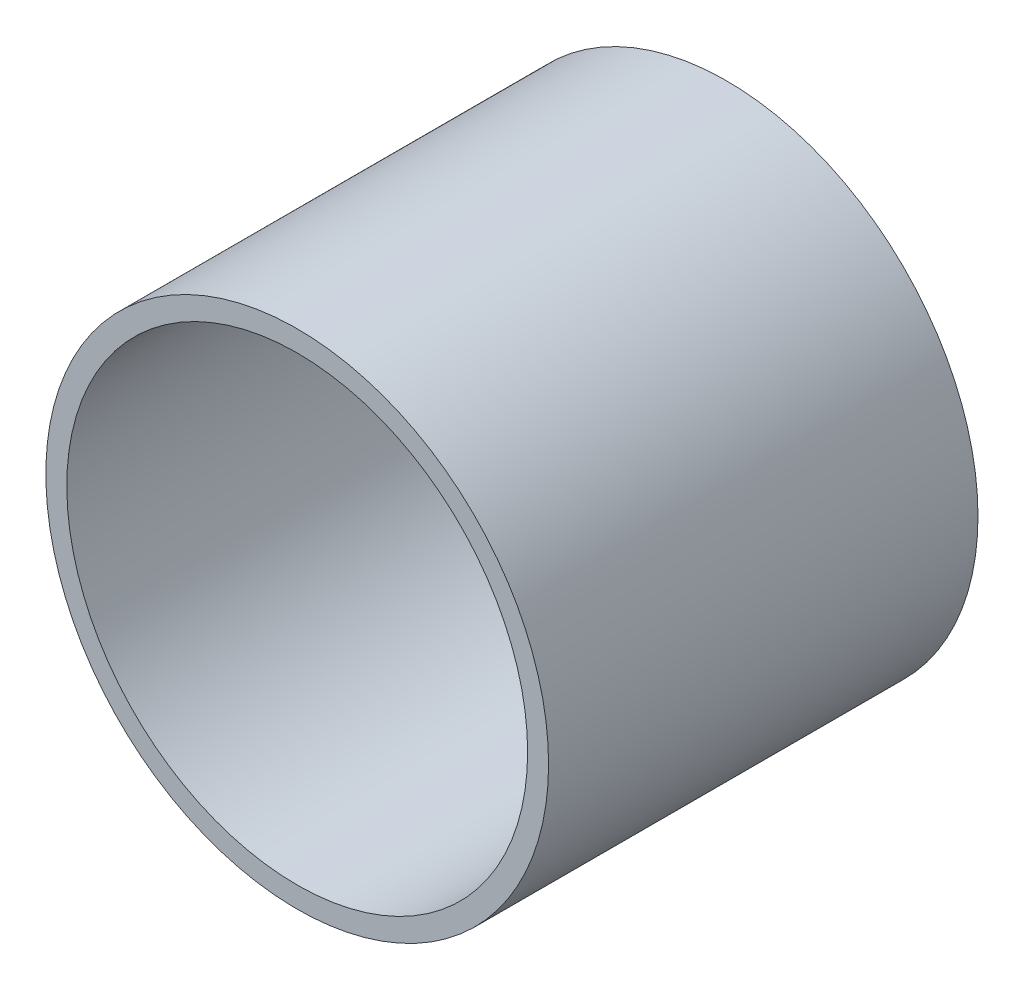
ISO-10303-21;
HEADER;
FILE_DESCRIPTION(('STEP AP214'),'2;1');
FILE_NAME('part.step','',(''),(''),'','','');
FILE_SCHEMA(('AUTOMOTIVE_DESIGN { 1 0 10303 214 1 1 1 1 }'));
ENDSEC;
DATA;
#1=APPLICATION_CONTEXT('core data for automotive mechanical design processes');
#2=APPLICATION_PROTOCOL_DEFINITION('international standard','automotive_design',2000,#1);
#3=PRODUCT_CONTEXT('',#1,'mechanical');
#4=PRODUCT('Part','Part','',(#3));
#5=PRODUCT_RELATED_PRODUCT_CATEGORY('part','',(#4));
#6=PRODUCT_DEFINITION_FORMATION('','',#4);
#7=PRODUCT_DEFINITION_CONTEXT('part definition',#1,'design');
#8=PRODUCT_DEFINITION('design','',#6,#7);
#9=PRODUCT_DEFINITION_SHAPE('','',#8);
#10=(LENGTH_UNIT() NAMED_UNIT(*) SI_UNIT(.MILLI.,.METRE.));
#11=(NAMED_UNIT(*) PLANE_ANGLE_UNIT() SI_UNIT($,.RADIAN.));
#12=(NAMED_UNIT(*) SI_UNIT($,.STERADIAN.) SOLID_ANGLE_UNIT());
#13=UNCERTAINTY_MEASURE_WITH_UNIT(LENGTH_MEASURE(1.E-05),#10,'distance_accuracy_value','');
#14=(GEOMETRIC_REPRESENTATION_CONTEXT(3) GLOBAL_UNCERTAINTY_ASSIGNED_CONTEXT((#13)) GLOBAL_UNIT_ASSIGNED_CONTEXT((#10,
#11,#12)) REPRESENTATION_CONTEXT('',''));
#15=CARTESIAN_POINT('',(0.,0.,0.));
#16=DIRECTION('',(0.,0.,1.));
#17=DIRECTION('',(1.,0.,0.));
#18=AXIS2_PLACEMENT_3D('',#15,#16,#17);
#19=CARTESIAN_POINT('',(0.,0.,104.14));
#20=DIRECTION('',(0.,0.,-1.));
#21=DIRECTION('',(-1.,0.,0.));
#22=AXIS2_PLACEMENT_3D('',#19,#20,#21);
#23=CYLINDRICAL_SURFACE('',#22,55.88);
#24=DIRECTION('',(0.,0.,-1.));
#25=VECTOR('',#24,1.);
#26=CARTESIAN_POINT('',(-7.6199999999994,-55.3580165829666,6.35));
#27=LINE('',#26,#25);
#28=CARTESIAN_POINT('',(-7.6199999999994,-55.3580165829666,6.35));
#29=VERTEX_POINT('',#28);
#30=CARTESIAN_POINT('',(-7.6199999999994,-55.3580165829666,0.));
#31=VERTEX_POINT('',#30);
#32=EDGE_CURVE('E208',#29,#31,#27,.T.);
#33=ORIENTED_EDGE('',*,*,#32,.T.);
#34=CARTESIAN_POINT('',(0.,0.,0.));
#35=DIRECTION('',(0.,0.,1.));
#36=DIRECTION('',(1.,0.,0.));
#37=AXIS2_PLACEMENT_3D('',#34,#35,#36);
#38=CIRCLE('',#37,55.88);
#39=CARTESIAN_POINT('',(-55.3580165829665,-7.61999999999999,0.));
#40=VERTEX_POINT('',#39);
#41=EDGE_CURVE('E369',#40,#31,#38,.T.);
#42=ORIENTED_EDGE('',*,*,#41,.F.);
#43=DIRECTION('',(0.,0.,-1.));
#44=VECTOR('',#43,1.);
#45=CARTESIAN_POINT('',(-55.3580165829665,-7.61999999999999,6.35));
#46=LINE('',#45,#44);
#47=CARTESIAN_POINT('',(-55.3580165829665,-7.61999999999999,6.35));
#48=VERTEX_POINT('',#47);
#49=EDGE_CURVE('E255',#48,#40,#46,.T.);
#50=ORIENTED_EDGE('',*,*,#49,.F.);
#51=CARTESIAN_POINT('',(0.,0.,6.35));
#52=DIRECTION('',(0.,0.,-1.));
#53=DIRECTION('',(1.,0.,0.));
#54=AXIS2_PLACEMENT_3D('',#51,#52,#53);
#55=CIRCLE('',#54,55.88);
#56=CARTESIAN_POINT('',(-55.3580165829665,7.61999999999998,6.35));
#57=VERTEX_POINT('',#56);
#58=EDGE_CURVE('E231',#48,#57,#55,.T.);
#59=ORIENTED_EDGE('',*,*,#58,.T.);
#60=DIRECTION('',(0.,0.,-1.));
#61=VECTOR('',#60,1.);
#62=CARTESIAN_POINT('',(-55.3580165829665,7.61999999999998,6.35));
#63=LINE('',#62,#61);
#64=CARTESIAN_POINT('',(-55.3580165829665,7.61999999999998,0.));
#65=VERTEX_POINT('',#64);
#66=EDGE_CURVE('E251',#57,#65,#63,.T.);
#67=ORIENTED_EDGE('',*,*,#66,.T.);
#68=CARTESIAN_POINT('',(-7.62000000000019,55.3580165829665,0.));
#69=VERTEX_POINT('',#68);
#70=EDGE_CURVE('E363',#69,#65,#38,.T.);
#71=ORIENTED_EDGE('',*,*,#70,.F.);
#72=DIRECTION('',(0.,0.,-1.));
#73=VECTOR('',#72,1.);
#74=CARTESIAN_POINT('',(-7.62000000000019,55.3580165829665,6.35));
#75=LINE('',#74,#73);
#76=CARTESIAN_POINT('',(-7.62000000000019,55.3580165829665,6.35));
#77=VERTEX_POINT('',#76);
#78=EDGE_CURVE('E303',#77,#69,#75,.T.);
#79=ORIENTED_EDGE('',*,*,#78,.F.);
#80=CARTESIAN_POINT('',(0.,0.,6.35));
#81=DIRECTION('',(0.,0.,-1.));
#82=DIRECTION('',(0.,-1.,0.));
#83=AXIS2_PLACEMENT_3D('',#80,#81,#82);
#84=CIRCLE('',#83,55.88);
#85=CARTESIAN_POINT('',(7.61999999999979,55.3580165829666,6.35));
#86=VERTEX_POINT('',#85);
#87=EDGE_CURVE('E277',#77,#86,#84,.T.);
#88=ORIENTED_EDGE('',*,*,#87,.T.);
#89=DIRECTION('',(0.,0.,-1.));
#90=VECTOR('',#89,1.);
#91=CARTESIAN_POINT('',(7.61999999999979,55.3580165829666,6.35));
#92=LINE('',#91,#90);
#93=CARTESIAN_POINT('',(7.61999999999979,55.3580165829666,0.));
#94=VERTEX_POINT('',#93);
#95=EDGE_CURVE('E299',#86,#94,#92,.T.);
#96=ORIENTED_EDGE('',*,*,#95,.T.);
#97=CARTESIAN_POINT('',(55.3580165829665,7.61999999999999,0.));
#98=VERTEX_POINT('',#97);
#99=EDGE_CURVE('E360',#98,#94,#38,.T.);
#100=ORIENTED_EDGE('',*,*,#99,.F.);
#101=DIRECTION('',(0.,0.,-1.));
#102=VECTOR('',#101,1.);
#103=CARTESIAN_POINT('',(55.3580165829665,7.61999999999999,6.35));
#104=LINE('',#103,#102);
#105=CARTESIAN_POINT('',(55.3580165829665,7.61999999999999,6.35));
#106=VERTEX_POINT('',#105);
#107=EDGE_CURVE('E352',#106,#98,#104,.T.);
#108=ORIENTED_EDGE('',*,*,#107,.F.);
#109=CARTESIAN_POINT('',(0.,0.,6.35));
#110=DIRECTION('',(0.,0.,-1.));
#111=DIRECTION('',(-1.,0.,0.));
#112=AXIS2_PLACEMENT_3D('',#109,#110,#111);
#113=CIRCLE('',#112,55.88);
#114=CARTESIAN_POINT('',(55.3580165829665,-7.61999999999998,6.35));
#115=VERTEX_POINT('',#114);
#116=EDGE_CURVE('E326',#106,#115,#113,.T.);
#117=ORIENTED_EDGE('',*,*,#116,.T.);
#118=DIRECTION('',(0.,0.,-1.));
#119=VECTOR('',#118,1.);
#120=CARTESIAN_POINT('',(55.3580165829665,-7.61999999999998,6.35));
#121=LINE('',#120,#119);
#122=CARTESIAN_POINT('',(55.3580165829665,-7.61999999999998,0.));
#123=VERTEX_POINT('',#122);
#124=EDGE_CURVE('E348',#115,#123,#121,.T.);
#125=ORIENTED_EDGE('',*,*,#124,.T.);
#126=CARTESIAN_POINT('',(7.62000000000057,-55.3580165829665,0.));
#127=VERTEX_POINT('',#126);
#128=EDGE_CURVE('E347',#127,#123,#38,.T.);
#129=ORIENTED_EDGE('',*,*,#128,.F.);
#130=DIRECTION('',(0.,0.,-1.));
#131=VECTOR('',#130,1.);
#132=CARTESIAN_POINT('',(7.62000000000057,-55.3580165829665,6.35));
#133=LINE('',#132,#131);
#134=CARTESIAN_POINT('',(7.62000000000057,-55.3580165829665,6.35));
#135=VERTEX_POINT('',#134);
#136=EDGE_CURVE('E170',#135,#127,#133,.T.);
#137=ORIENTED_EDGE('',*,*,#136,.F.);
#138=CARTESIAN_POINT('',(0.,0.,6.35));
#139=DIRECTION('',(0.,0.,-1.));
#140=DIRECTION('',(0.,1.,0.));
#141=AXIS2_PLACEMENT_3D('',#138,#139,#140);
#142=CIRCLE('',#141,55.88);
#143=EDGE_CURVE('E180',#135,#29,#142,.T.);
#144=ORIENTED_EDGE('',*,*,#143,.T.);
#145=EDGE_LOOP('',(#33,#42,#50,#59,#67,#71,#79,#88,#96,#100,#108,#117,#125,#129,#137,#144));
#146=FACE_BOUND('',#145,.T.);
#147=CARTESIAN_POINT('',(0.,0.,104.14));
#148=DIRECTION('',(0.,0.,1.));
#149=DIRECTION('',(1.,0.,0.));
#150=AXIS2_PLACEMENT_3D('',#147,#148,#149);
#151=CIRCLE('',#150,55.88);
#152=CARTESIAN_POINT('',(55.88,0.,104.14));
#153=VERTEX_POINT('',#152);
#154=EDGE_CURVE('E54',#153,#153,#151,.T.);
#155=ORIENTED_EDGE('',*,*,#154,.T.);
#156=EDGE_LOOP('',(#155));
#157=FACE_BOUND('',#156,.T.);
#158=ADVANCED_FACE('F45',(#146,#157),#23,.F.);
#159=CARTESIAN_POINT('',(0.,0.,104.14));
#160=DIRECTION('',(0.,0.,-1.));
#161=DIRECTION('',(-1.,0.,0.));
#162=AXIS2_PLACEMENT_3D('',#159,#160,#161);
#163=CYLINDRICAL_SURFACE('',#162,60.96);
#164=CARTESIAN_POINT('',(0.,0.,104.14));
#165=DIRECTION('',(0.,0.,1.));
#166=DIRECTION('',(1.,0.,0.));
#167=AXIS2_PLACEMENT_3D('',#164,#165,#166);
#168=CIRCLE('',#167,60.96);
#169=CARTESIAN_POINT('',(60.96,0.,104.14));
#170=VERTEX_POINT('',#169);
#171=EDGE_CURVE('E11',#170,#170,#168,.T.);
#172=ORIENTED_EDGE('',*,*,#171,.F.);
#173=EDGE_LOOP('',(#172));
#174=FACE_BOUND('',#173,.T.);
#175=CARTESIAN_POINT('',(0.,0.,0.));
#176=DIRECTION('',(0.,0.,1.));
#177=DIRECTION('',(1.,0.,0.));
#178=AXIS2_PLACEMENT_3D('',#175,#176,#177);
#179=CIRCLE('',#178,60.96);
#180=CARTESIAN_POINT('',(60.96,0.,0.));
#181=VERTEX_POINT('',#180);
#182=EDGE_CURVE('E48',#181,#181,#179,.T.);
#183=ORIENTED_EDGE('',*,*,#182,.T.);
#184=EDGE_LOOP('',(#183));
#185=FACE_BOUND('',#184,.T.);
#186=ADVANCED_FACE('F393',(#174,#185),#163,.T.);
#187=CARTESIAN_POINT('',(0.,0.,104.14));
#188=DIRECTION('',(0.,0.,1.));
#189=DIRECTION('',(1.,0.,0.));
#190=AXIS2_PLACEMENT_3D('',#187,#188,#189);
#191=PLANE('',#190);
#192=ORIENTED_EDGE('',*,*,#154,.F.);
#193=EDGE_LOOP('',(#192));
#194=FACE_BOUND('',#193,.T.);
#195=ORIENTED_EDGE('',*,*,#171,.T.);
#196=EDGE_LOOP('',(#195));
#197=FACE_BOUND('',#196,.T.);
#198=ADVANCED_FACE('F397',(#194,#197),#191,.T.);
#199=CARTESIAN_POINT('',(0.,0.,0.));
#200=DIRECTION('',(0.,0.,1.));
#201=DIRECTION('',(1.,0.,0.));
#202=AXIS2_PLACEMENT_3D('',#199,#200,#201);
#203=PLANE('',#202);
#204=ORIENTED_EDGE('',*,*,#99,.T.);
#205=DIRECTION('',(0.,-1.,0.));
#206=VECTOR('',#205,1.);
#207=CARTESIAN_POINT('',(7.61999999999983,48.26,0.));
#208=LINE('',#207,#206);
#209=CARTESIAN_POINT('',(7.61999999999983,48.26,0.));
#210=VERTEX_POINT('',#209);
#211=EDGE_CURVE('E273',#94,#210,#208,.T.);
#212=ORIENTED_EDGE('',*,*,#211,.T.);
#213=CARTESIAN_POINT('',(-1.6849888941257E-13,48.26,0.));
#214=DIRECTION('',(0.,0.,-1.));
#215=DIRECTION('',(0.,-1.,0.));
#216=AXIS2_PLACEMENT_3D('',#213,#214,#215);
#217=CIRCLE('',#216,7.61999999999999);
#218=CARTESIAN_POINT('',(-7.62000000000016,48.26,0.));
#219=VERTEX_POINT('',#218);
#220=EDGE_CURVE('E264',#210,#219,#217,.T.);
#221=ORIENTED_EDGE('',*,*,#220,.T.);
#222=DIRECTION('',(0.,1.,0.));
#223=VECTOR('',#222,1.);
#224=CARTESIAN_POINT('',(-7.62000000000016,48.26,0.));
#225=LINE('',#224,#223);
#226=EDGE_CURVE('E289',#219,#69,#225,.T.);
#227=ORIENTED_EDGE('',*,*,#226,.T.);
#228=ORIENTED_EDGE('',*,*,#70,.T.);
#229=DIRECTION('',(1.,0.,0.));
#230=VECTOR('',#229,1.);
#231=CARTESIAN_POINT('',(-48.26,7.61999999999999,0.));
#232=LINE('',#231,#230);
#233=CARTESIAN_POINT('',(-48.26,7.61999999999999,0.));
#234=VERTEX_POINT('',#233);
#235=EDGE_CURVE('E227',#65,#234,#232,.T.);
#236=ORIENTED_EDGE('',*,*,#235,.T.);
#237=CARTESIAN_POINT('',(-48.26,0.,0.));
#238=DIRECTION('',(0.,0.,-1.));
#239=DIRECTION('',(1.,0.,0.));
#240=AXIS2_PLACEMENT_3D('',#237,#238,#239);
#241=CIRCLE('',#240,7.61999999999999);
#242=CARTESIAN_POINT('',(-48.26,-7.61999999999999,0.));
#243=VERTEX_POINT('',#242);
#244=EDGE_CURVE('E218',#234,#243,#241,.T.);
#245=ORIENTED_EDGE('',*,*,#244,.T.);
#246=DIRECTION('',(-1.,0.,0.));
#247=VECTOR('',#246,1.);
#248=CARTESIAN_POINT('',(-48.26,-7.61999999999999,0.));
#249=LINE('',#248,#247);
#250=EDGE_CURVE('E69',#243,#40,#249,.T.);
#251=ORIENTED_EDGE('',*,*,#250,.T.);
#252=ORIENTED_EDGE('',*,*,#41,.T.);
#253=DIRECTION('',(0.,1.,0.));
#254=VECTOR('',#253,1.);
#255=CARTESIAN_POINT('',(-7.61999999999949,-48.2600000000001,0.));
#256=LINE('',#255,#254);
#257=CARTESIAN_POINT('',(-7.61999999999949,-48.2600000000001,0.));
#258=VERTEX_POINT('',#257);
#259=EDGE_CURVE('E186',#31,#258,#256,.T.);
#260=ORIENTED_EDGE('',*,*,#259,.T.);
#261=CARTESIAN_POINT('',(5.05496668237709E-13,-48.26,0.));
#262=DIRECTION('',(0.,0.,-1.));
#263=DIRECTION('',(0.,1.,0.));
#264=AXIS2_PLACEMENT_3D('',#261,#262,#263);
#265=CIRCLE('',#264,7.61999999999999);
#266=CARTESIAN_POINT('',(7.6200000000005,-48.2599999999999,0.));
#267=VERTEX_POINT('',#266);
#268=EDGE_CURVE('E199',#258,#267,#265,.T.);
#269=ORIENTED_EDGE('',*,*,#268,.T.);
#270=DIRECTION('',(0.,-1.,0.));
#271=VECTOR('',#270,1.);
#272=CARTESIAN_POINT('',(7.6200000000005,-48.2599999999999,0.));
#273=LINE('',#272,#271);
#274=EDGE_CURVE('E62',#267,#127,#273,.T.);
#275=ORIENTED_EDGE('',*,*,#274,.T.);
#276=ORIENTED_EDGE('',*,*,#128,.T.);
#277=DIRECTION('',(-1.,0.,0.));
#278=VECTOR('',#277,1.);
#279=CARTESIAN_POINT('',(48.26,-7.61999999999999,0.));
#280=LINE('',#279,#278);
#281=CARTESIAN_POINT('',(48.26,-7.61999999999999,0.));
#282=VERTEX_POINT('',#281);
#283=EDGE_CURVE('E322',#123,#282,#280,.T.);
#284=ORIENTED_EDGE('',*,*,#283,.T.);
#285=CARTESIAN_POINT('',(48.26,0.,0.));
#286=DIRECTION('',(0.,0.,-1.));
#287=DIRECTION('',(-1.,0.,0.));
#288=AXIS2_PLACEMENT_3D('',#285,#286,#287);
#289=CIRCLE('',#288,7.61999999999999);
#290=CARTESIAN_POINT('',(48.26,7.61999999999999,0.));
#291=VERTEX_POINT('',#290);
#292=EDGE_CURVE('E313',#282,#291,#289,.T.);
#293=ORIENTED_EDGE('',*,*,#292,.T.);
#294=DIRECTION('',(1.,0.,0.));
#295=VECTOR('',#294,1.);
#296=CARTESIAN_POINT('',(48.26,7.61999999999999,0.));
#297=LINE('',#296,#295);
#298=EDGE_CURVE('E338',#291,#98,#297,.T.);
#299=ORIENTED_EDGE('',*,*,#298,.T.);
#300=EDGE_LOOP('',(#204,#212,#221,#227,#228,#236,#245,#251,#252,#260,#269,#275,#276,#284,#293,#299));
#301=FACE_BOUND('',#300,.T.);
#302=ORIENTED_EDGE('',*,*,#182,.F.);
#303=EDGE_LOOP('',(#302));
#304=FACE_BOUND('',#303,.T.);
#305=CARTESIAN_POINT('',(48.26,0.,0.));
#306=DIRECTION('',(0.,0.,-1.));
#307=DIRECTION('',(-1.,0.,0.));
#308=AXIS2_PLACEMENT_3D('',#305,#306,#307);
#309=CIRCLE('',#308,3.3782);
#310=CARTESIAN_POINT('',(44.8818,0.,0.));
#311=VERTEX_POINT('',#310);
#312=EDGE_CURVE('E298',#311,#311,#309,.T.);
#313=ORIENTED_EDGE('',*,*,#312,.F.);
#314=EDGE_LOOP('',(#313));
#315=FACE_BOUND('',#314,.T.);
#316=CARTESIAN_POINT('',(-1.6849888941257E-13,48.26,0.));
#317=DIRECTION('',(0.,0.,-1.));
#318=DIRECTION('',(0.,-1.,0.));
#319=AXIS2_PLACEMENT_3D('',#316,#317,#318);
#320=CIRCLE('',#319,3.3782);
#321=CARTESIAN_POINT('',(-1.5670396715369E-13,44.8818,0.));
#322=VERTEX_POINT('',#321);
#323=EDGE_CURVE('E250',#322,#322,#320,.T.);
#324=ORIENTED_EDGE('',*,*,#323,.F.);
#325=EDGE_LOOP('',(#324));
#326=FACE_BOUND('',#325,.T.);
#327=CARTESIAN_POINT('',(-48.26,0.,0.));
#328=DIRECTION('',(0.,0.,-1.));
#329=DIRECTION('',(1.,0.,0.));
#330=AXIS2_PLACEMENT_3D('',#327,#328,#329);
#331=CIRCLE('',#330,3.3782);
#332=CARTESIAN_POINT('',(-44.8818,0.,0.));
#333=VERTEX_POINT('',#332);
#334=EDGE_CURVE('E207',#333,#333,#331,.T.);
#335=ORIENTED_EDGE('',*,*,#334,.F.);
#336=EDGE_LOOP('',(#335));
#337=FACE_BOUND('',#336,.T.);
#338=CARTESIAN_POINT('',(5.05496668237709E-13,-48.26,0.));
#339=DIRECTION('',(0.,0.,-1.));
#340=DIRECTION('',(0.,1.,0.));
#341=AXIS2_PLACEMENT_3D('',#338,#339,#340);
#342=CIRCLE('',#341,3.3782);
#343=CARTESIAN_POINT('',(4.70111901461069E-13,-44.8818,0.));
#344=VERTEX_POINT('',#343);
#345=EDGE_CURVE('E192',#344,#344,#342,.T.);
#346=ORIENTED_EDGE('',*,*,#345,.F.);
#347=EDGE_LOOP('',(#346));
#348=FACE_BOUND('',#347,.T.);
#349=ADVANCED_FACE('F375',(#301,#304,#315,#326,#337,#348),#203,.F.);
#350=CARTESIAN_POINT('',(48.26,0.,6.35));
#351=DIRECTION('',(0.,0.,-1.));
#352=DIRECTION('',(-1.,0.,0.));
#353=AXIS2_PLACEMENT_3D('',#350,#351,#352);
#354=CYLINDRICAL_SURFACE('',#353,7.61999999999999);
#355=ORIENTED_EDGE('',*,*,#292,.F.);
#356=DIRECTION('',(0.,0.,-1.));
#357=VECTOR('',#356,1.);
#358=CARTESIAN_POINT('',(48.26,-7.61999999999999,6.35));
#359=LINE('',#358,#357);
#360=CARTESIAN_POINT('',(48.26,-7.61999999999999,6.35));
#361=VERTEX_POINT('',#360);
#362=EDGE_CURVE('E344',#361,#282,#359,.T.);
#363=ORIENTED_EDGE('',*,*,#362,.F.);
#364=CARTESIAN_POINT('',(48.26,0.,6.35));
#365=DIRECTION('',(0.,0.,-1.));
#366=DIRECTION('',(-1.,0.,0.));
#367=AXIS2_PLACEMENT_3D('',#364,#365,#366);
#368=CIRCLE('',#367,7.61999999999999);
#369=CARTESIAN_POINT('',(48.26,7.61999999999999,6.35));
#370=VERTEX_POINT('',#369);
#371=EDGE_CURVE('E317',#361,#370,#368,.T.);
#372=ORIENTED_EDGE('',*,*,#371,.T.);
#373=DIRECTION('',(0.,0.,-1.));
#374=VECTOR('',#373,1.);
#375=CARTESIAN_POINT('',(48.26,7.61999999999999,6.35));
#376=LINE('',#375,#374);
#377=EDGE_CURVE('E334',#370,#291,#376,.T.);
#378=ORIENTED_EDGE('',*,*,#377,.T.);
#379=EDGE_LOOP('',(#355,#363,#372,#378));
#380=FACE_BOUND('',#379,.T.);
#381=ADVANCED_FACE('F408',(#380),#354,.T.);
#382=CARTESIAN_POINT('',(48.26,-7.61999999999999,6.35));
#383=DIRECTION('',(0.,-1.,0.));
#384=DIRECTION('',(1.,0.,0.));
#385=AXIS2_PLACEMENT_3D('',#382,#383,#384);
#386=PLANE('',#385);
#387=ORIENTED_EDGE('',*,*,#283,.F.);
#388=ORIENTED_EDGE('',*,*,#124,.F.);
#389=DIRECTION('',(-1.,0.,0.));
#390=VECTOR('',#389,1.);
#391=CARTESIAN_POINT('',(48.26,-7.61999999999999,6.35));
#392=LINE('',#391,#390);
#393=EDGE_CURVE('E330',#115,#361,#392,.T.);
#394=ORIENTED_EDGE('',*,*,#393,.T.);
#395=ORIENTED_EDGE('',*,*,#362,.T.);
#396=EDGE_LOOP('',(#387,#388,#394,#395));
#397=FACE_BOUND('',#396,.T.);
#398=ADVANCED_FACE('F412',(#397),#386,.T.);
#399=CARTESIAN_POINT('',(48.26,7.61999999999999,6.35));
#400=DIRECTION('',(0.,1.,0.));
#401=DIRECTION('',(-1.,0.,0.));
#402=AXIS2_PLACEMENT_3D('',#399,#400,#401);
#403=PLANE('',#402);
#404=ORIENTED_EDGE('',*,*,#298,.F.);
#405=ORIENTED_EDGE('',*,*,#377,.F.);
#406=DIRECTION('',(1.,0.,0.));
#407=VECTOR('',#406,1.);
#408=CARTESIAN_POINT('',(48.26,7.61999999999999,6.35));
#409=LINE('',#408,#407);
#410=EDGE_CURVE('E321',#370,#106,#409,.T.);
#411=ORIENTED_EDGE('',*,*,#410,.T.);
#412=ORIENTED_EDGE('',*,*,#107,.T.);
#413=EDGE_LOOP('',(#404,#405,#411,#412));
#414=FACE_BOUND('',#413,.T.);
#415=ADVANCED_FACE('F414',(#414),#403,.T.);
#416=CARTESIAN_POINT('',(48.26,0.,6.35));
#417=DIRECTION('',(0.,0.,-1.));
#418=DIRECTION('',(-1.,0.,0.));
#419=AXIS2_PLACEMENT_3D('',#416,#417,#418);
#420=PLANE('',#419);
#421=CARTESIAN_POINT('',(48.26,0.,6.35));
#422=DIRECTION('',(0.,0.,-1.));
#423=DIRECTION('',(-1.,0.,0.));
#424=AXIS2_PLACEMENT_3D('',#421,#422,#423);
#425=CIRCLE('',#424,3.3782);
#426=CARTESIAN_POINT('',(44.8818,0.,6.35));
#427=VERTEX_POINT('',#426);
#428=EDGE_CURVE('E309',#427,#427,#425,.T.);
#429=ORIENTED_EDGE('',*,*,#428,.T.);
#430=EDGE_LOOP('',(#429));
#431=FACE_BOUND('',#430,.T.);
#432=ORIENTED_EDGE('',*,*,#371,.F.);
#433=ORIENTED_EDGE('',*,*,#393,.F.);
#434=ORIENTED_EDGE('',*,*,#116,.F.);
#435=ORIENTED_EDGE('',*,*,#410,.F.);
#436=EDGE_LOOP('',(#432,#433,#434,#435));
#437=FACE_BOUND('',#436,.T.);
#438=ADVANCED_FACE('F417',(#431,#437),#420,.F.);
#439=CARTESIAN_POINT('',(48.26,0.,6.35));
#440=DIRECTION('',(0.,0.,-1.));
#441=DIRECTION('',(-1.,0.,0.));
#442=AXIS2_PLACEMENT_3D('',#439,#440,#441);
#443=CYLINDRICAL_SURFACE('',#442,3.3782);
#444=ORIENTED_EDGE('',*,*,#428,.F.);
#445=EDGE_LOOP('',(#444));
#446=FACE_BOUND('',#445,.T.);
#447=ORIENTED_EDGE('',*,*,#312,.T.);
#448=EDGE_LOOP('',(#447));
#449=FACE_BOUND('',#448,.T.);
#450=ADVANCED_FACE('F424',(#446,#449),#443,.F.);
#451=CARTESIAN_POINT('',(-1.6849888941257E-13,48.26,6.35));
#452=DIRECTION('',(0.,0.,-1.));
#453=DIRECTION('',(-1.,0.,0.));
#454=AXIS2_PLACEMENT_3D('',#451,#452,#453);
#455=CYLINDRICAL_SURFACE('',#454,7.61999999999999);
#456=ORIENTED_EDGE('',*,*,#220,.F.);
#457=DIRECTION('',(0.,0.,-1.));
#458=VECTOR('',#457,1.);
#459=CARTESIAN_POINT('',(7.61999999999983,48.26,6.35));
#460=LINE('',#459,#458);
#461=CARTESIAN_POINT('',(7.61999999999983,48.26,6.35));
#462=VERTEX_POINT('',#461);
#463=EDGE_CURVE('E295',#462,#210,#460,.T.);
#464=ORIENTED_EDGE('',*,*,#463,.F.);
#465=CARTESIAN_POINT('',(-1.6849888941257E-13,48.26,6.35));
#466=DIRECTION('',(0.,0.,-1.));
#467=DIRECTION('',(0.,-1.,0.));
#468=AXIS2_PLACEMENT_3D('',#465,#466,#467);
#469=CIRCLE('',#468,7.61999999999999);
#470=CARTESIAN_POINT('',(-7.62000000000016,48.26,6.35));
#471=VERTEX_POINT('',#470);
#472=EDGE_CURVE('E268',#462,#471,#469,.T.);
#473=ORIENTED_EDGE('',*,*,#472,.T.);
#474=DIRECTION('',(0.,0.,-1.));
#475=VECTOR('',#474,1.);
#476=CARTESIAN_POINT('',(-7.62000000000016,48.26,6.35));
#477=LINE('',#476,#475);
#478=EDGE_CURVE('E285',#471,#219,#477,.T.);
#479=ORIENTED_EDGE('',*,*,#478,.T.);
#480=EDGE_LOOP('',(#456,#464,#473,#479));
#481=FACE_BOUND('',#480,.T.);
#482=ADVANCED_FACE('F428',(#481),#455,.T.);
#483=CARTESIAN_POINT('',(7.61999999999983,48.26,6.35));
#484=DIRECTION('',(1.,0.,0.));
#485=DIRECTION('',(0.,1.,0.));
#486=AXIS2_PLACEMENT_3D('',#483,#484,#485);
#487=PLANE('',#486);
#488=ORIENTED_EDGE('',*,*,#211,.F.);
#489=ORIENTED_EDGE('',*,*,#95,.F.);
#490=DIRECTION('',(0.,-1.,0.));
#491=VECTOR('',#490,1.);
#492=CARTESIAN_POINT('',(7.61999999999983,48.26,6.35));
#493=LINE('',#492,#491);
#494=EDGE_CURVE('E281',#86,#462,#493,.T.);
#495=ORIENTED_EDGE('',*,*,#494,.T.);
#496=ORIENTED_EDGE('',*,*,#463,.T.);
#497=EDGE_LOOP('',(#488,#489,#495,#496));
#498=FACE_BOUND('',#497,.T.);
#499=ADVANCED_FACE('F432',(#498),#487,.T.);
#500=CARTESIAN_POINT('',(-7.62000000000016,48.26,6.35));
#501=DIRECTION('',(-1.,0.,0.));
#502=DIRECTION('',(0.,-1.,0.));
#503=AXIS2_PLACEMENT_3D('',#500,#501,#502);
#504=PLANE('',#503);
#505=ORIENTED_EDGE('',*,*,#226,.F.);
#506=ORIENTED_EDGE('',*,*,#478,.F.);
#507=DIRECTION('',(0.,1.,0.));
#508=VECTOR('',#507,1.);
#509=CARTESIAN_POINT('',(-7.62000000000016,48.26,6.35));
#510=LINE('',#509,#508);
#511=EDGE_CURVE('E272',#471,#77,#510,.T.);
#512=ORIENTED_EDGE('',*,*,#511,.T.);
#513=ORIENTED_EDGE('',*,*,#78,.T.);
#514=EDGE_LOOP('',(#505,#506,#512,#513));
#515=FACE_BOUND('',#514,.T.);
#516=ADVANCED_FACE('F434',(#515),#504,.T.);
#517=CARTESIAN_POINT('',(-1.6849888941257E-13,48.26,6.35));
#518=DIRECTION('',(0.,0.,-1.));
#519=DIRECTION('',(0.,-1.,0.));
#520=AXIS2_PLACEMENT_3D('',#517,#518,#519);
#521=PLANE('',#520);
#522=CARTESIAN_POINT('',(-1.6849888941257E-13,48.26,6.35));
#523=DIRECTION('',(0.,0.,-1.));
#524=DIRECTION('',(0.,-1.,0.));
#525=AXIS2_PLACEMENT_3D('',#522,#523,#524);
#526=CIRCLE('',#525,3.3782);
#527=CARTESIAN_POINT('',(-1.5670396715369E-13,44.8818,6.35));
#528=VERTEX_POINT('',#527);
#529=EDGE_CURVE('E260',#528,#528,#526,.T.);
#530=ORIENTED_EDGE('',*,*,#529,.T.);
#531=EDGE_LOOP('',(#530));
#532=FACE_BOUND('',#531,.T.);
#533=ORIENTED_EDGE('',*,*,#472,.F.);
#534=ORIENTED_EDGE('',*,*,#494,.F.);
#535=ORIENTED_EDGE('',*,*,#87,.F.);
#536=ORIENTED_EDGE('',*,*,#511,.F.);
#537=EDGE_LOOP('',(#533,#534,#535,#536));
#538=FACE_BOUND('',#537,.T.);
#539=ADVANCED_FACE('F437',(#532,#538),#521,.F.);
#540=CARTESIAN_POINT('',(-1.6849888941257E-13,48.26,6.35));
#541=DIRECTION('',(0.,0.,-1.));
#542=DIRECTION('',(-1.,0.,0.));
#543=AXIS2_PLACEMENT_3D('',#540,#541,#542);
#544=CYLINDRICAL_SURFACE('',#543,3.3782);
#545=ORIENTED_EDGE('',*,*,#529,.F.);
#546=EDGE_LOOP('',(#545));
#547=FACE_BOUND('',#546,.T.);
#548=ORIENTED_EDGE('',*,*,#323,.T.);
#549=EDGE_LOOP('',(#548));
#550=FACE_BOUND('',#549,.T.);
#551=ADVANCED_FACE('F444',(#547,#550),#544,.F.);
#552=CARTESIAN_POINT('',(-48.26,0.,6.35));
#553=DIRECTION('',(0.,0.,-1.));
#554=DIRECTION('',(-1.,0.,0.));
#555=AXIS2_PLACEMENT_3D('',#552,#553,#554);
#556=CYLINDRICAL_SURFACE('',#555,7.61999999999999);
#557=ORIENTED_EDGE('',*,*,#244,.F.);
#558=DIRECTION('',(0.,0.,-1.));
#559=VECTOR('',#558,1.);
#560=CARTESIAN_POINT('',(-48.26,7.61999999999999,6.35));
#561=LINE('',#560,#559);
#562=CARTESIAN_POINT('',(-48.26,7.61999999999999,6.35));
#563=VERTEX_POINT('',#562);
#564=EDGE_CURVE('E247',#563,#234,#561,.T.);
#565=ORIENTED_EDGE('',*,*,#564,.F.);
#566=CARTESIAN_POINT('',(-48.26,0.,6.35));
#567=DIRECTION('',(0.,0.,-1.));
#568=DIRECTION('',(1.,0.,0.));
#569=AXIS2_PLACEMENT_3D('',#566,#567,#568);
#570=CIRCLE('',#569,7.61999999999999);
#571=CARTESIAN_POINT('',(-48.26,-7.61999999999999,6.35));
#572=VERTEX_POINT('',#571);
#573=EDGE_CURVE('E222',#563,#572,#570,.T.);
#574=ORIENTED_EDGE('',*,*,#573,.T.);
#575=DIRECTION('',(0.,0.,-1.));
#576=VECTOR('',#575,1.);
#577=CARTESIAN_POINT('',(-48.26,-7.61999999999999,6.35));
#578=LINE('',#577,#576);
#579=EDGE_CURVE('E239',#572,#243,#578,.T.);
#580=ORIENTED_EDGE('',*,*,#579,.T.);
#581=EDGE_LOOP('',(#557,#565,#574,#580));
#582=FACE_BOUND('',#581,.T.);
#583=ADVANCED_FACE('F448',(#582),#556,.T.);
#584=CARTESIAN_POINT('',(-48.26,7.61999999999999,6.35));
#585=DIRECTION('',(0.,1.,0.));
#586=DIRECTION('',(-1.,0.,0.));
#587=AXIS2_PLACEMENT_3D('',#584,#585,#586);
#588=PLANE('',#587);
#589=ORIENTED_EDGE('',*,*,#235,.F.);
#590=ORIENTED_EDGE('',*,*,#66,.F.);
#591=DIRECTION('',(1.,0.,0.));
#592=VECTOR('',#591,1.);
#593=CARTESIAN_POINT('',(-48.26,7.61999999999999,6.35));
#594=LINE('',#593,#592);
#595=EDGE_CURVE('E235',#57,#563,#594,.T.);
#596=ORIENTED_EDGE('',*,*,#595,.T.);
#597=ORIENTED_EDGE('',*,*,#564,.T.);
#598=EDGE_LOOP('',(#589,#590,#596,#597));
#599=FACE_BOUND('',#598,.T.);
#600=ADVANCED_FACE('F452',(#599),#588,.T.);
#601=CARTESIAN_POINT('',(-48.26,-7.61999999999999,6.35));
#602=DIRECTION('',(0.,-1.,0.));
#603=DIRECTION('',(1.,0.,0.));
#604=AXIS2_PLACEMENT_3D('',#601,#602,#603);
#605=PLANE('',#604);
#606=ORIENTED_EDGE('',*,*,#250,.F.);
#607=ORIENTED_EDGE('',*,*,#579,.F.);
#608=DIRECTION('',(-1.,0.,0.));
#609=VECTOR('',#608,1.);
#610=CARTESIAN_POINT('',(-48.26,-7.61999999999999,6.35));
#611=LINE('',#610,#609);
#612=EDGE_CURVE('E226',#572,#48,#611,.T.);
#613=ORIENTED_EDGE('',*,*,#612,.T.);
#614=ORIENTED_EDGE('',*,*,#49,.T.);
#615=EDGE_LOOP('',(#606,#607,#613,#614));
#616=FACE_BOUND('',#615,.T.);
#617=ADVANCED_FACE('F454',(#616),#605,.T.);
#618=CARTESIAN_POINT('',(-48.26,0.,6.35));
#619=DIRECTION('',(0.,0.,-1.));
#620=DIRECTION('',(1.,0.,0.));
#621=AXIS2_PLACEMENT_3D('',#618,#619,#620);
#622=PLANE('',#621);
#623=CARTESIAN_POINT('',(-48.26,0.,6.35));
#624=DIRECTION('',(0.,0.,-1.));
#625=DIRECTION('',(1.,0.,0.));
#626=AXIS2_PLACEMENT_3D('',#623,#624,#625);
#627=CIRCLE('',#626,3.3782);
#628=CARTESIAN_POINT('',(-44.8818,0.,6.35));
#629=VERTEX_POINT('',#628);
#630=EDGE_CURVE('E214',#629,#629,#627,.T.);
#631=ORIENTED_EDGE('',*,*,#630,.T.);
#632=EDGE_LOOP('',(#631));
#633=FACE_BOUND('',#632,.T.);
#634=ORIENTED_EDGE('',*,*,#573,.F.);
#635=ORIENTED_EDGE('',*,*,#595,.F.);
#636=ORIENTED_EDGE('',*,*,#58,.F.);
#637=ORIENTED_EDGE('',*,*,#612,.F.);
#638=EDGE_LOOP('',(#634,#635,#636,#637));
#639=FACE_BOUND('',#638,.T.);
#640=ADVANCED_FACE('F457',(#633,#639),#622,.F.);
#641=CARTESIAN_POINT('',(-48.26,0.,6.35));
#642=DIRECTION('',(0.,0.,-1.));
#643=DIRECTION('',(-1.,0.,0.));
#644=AXIS2_PLACEMENT_3D('',#641,#642,#643);
#645=CYLINDRICAL_SURFACE('',#644,3.3782);
#646=ORIENTED_EDGE('',*,*,#630,.F.);
#647=EDGE_LOOP('',(#646));
#648=FACE_BOUND('',#647,.T.);
#649=ORIENTED_EDGE('',*,*,#334,.T.);
#650=EDGE_LOOP('',(#649));
#651=FACE_BOUND('',#650,.T.);
#652=ADVANCED_FACE('F389',(#648,#651),#645,.F.);
#653=CARTESIAN_POINT('',(5.05496668237709E-13,-48.26,6.35));
#654=DIRECTION('',(0.,0.,-1.));
#655=DIRECTION('',(-1.,0.,0.));
#656=AXIS2_PLACEMENT_3D('',#653,#654,#655);
#657=CYLINDRICAL_SURFACE('',#656,7.61999999999999);
#658=ORIENTED_EDGE('',*,*,#268,.F.);
#659=DIRECTION('',(0.,0.,-1.));
#660=VECTOR('',#659,1.);
#661=CARTESIAN_POINT('',(-7.61999999999949,-48.2600000000001,6.35));
#662=LINE('',#661,#660);
#663=CARTESIAN_POINT('',(-7.61999999999949,-48.2600000000001,6.35));
#664=VERTEX_POINT('',#663);
#665=EDGE_CURVE('E184',#664,#258,#662,.T.);
#666=ORIENTED_EDGE('',*,*,#665,.F.);
#667=CARTESIAN_POINT('',(5.05496668237709E-13,-48.26,6.35));
#668=DIRECTION('',(0.,0.,-1.));
#669=DIRECTION('',(0.,1.,0.));
#670=AXIS2_PLACEMENT_3D('',#667,#668,#669);
#671=CIRCLE('',#670,7.61999999999999);
#672=CARTESIAN_POINT('',(7.6200000000005,-48.2599999999999,6.35));
#673=VERTEX_POINT('',#672);
#674=EDGE_CURVE('E177',#664,#673,#671,.T.);
#675=ORIENTED_EDGE('',*,*,#674,.T.);
#676=DIRECTION('',(0.,0.,-1.));
#677=VECTOR('',#676,1.);
#678=CARTESIAN_POINT('',(7.6200000000005,-48.2599999999999,6.35));
#679=LINE('',#678,#677);
#680=EDGE_CURVE('E161',#673,#267,#679,.T.);
#681=ORIENTED_EDGE('',*,*,#680,.T.);
#682=EDGE_LOOP('',(#658,#666,#675,#681));
#683=FACE_BOUND('',#682,.T.);
#684=ADVANCED_FACE('F183',(#683),#657,.T.);
#685=CARTESIAN_POINT('',(-7.61999999999949,-48.2600000000001,6.35));
#686=DIRECTION('',(-1.,0.,0.));
#687=DIRECTION('',(0.,-1.,0.));
#688=AXIS2_PLACEMENT_3D('',#685,#686,#687);
#689=PLANE('',#688);
#690=ORIENTED_EDGE('',*,*,#259,.F.);
#691=ORIENTED_EDGE('',*,*,#32,.F.);
#692=DIRECTION('',(0.,1.,0.));
#693=VECTOR('',#692,1.);
#694=CARTESIAN_POINT('',(-7.61999999999949,-48.2600000000001,6.35));
#695=LINE('',#694,#693);
#696=EDGE_CURVE('E171',#29,#664,#695,.T.);
#697=ORIENTED_EDGE('',*,*,#696,.T.);
#698=ORIENTED_EDGE('',*,*,#665,.T.);
#699=EDGE_LOOP('',(#690,#691,#697,#698));
#700=FACE_BOUND('',#699,.T.);
#701=ADVANCED_FACE('F381',(#700),#689,.T.);
#702=CARTESIAN_POINT('',(7.6200000000005,-48.2599999999999,6.35));
#703=DIRECTION('',(1.,0.,0.));
#704=DIRECTION('',(0.,1.,0.));
#705=AXIS2_PLACEMENT_3D('',#702,#703,#704);
#706=PLANE('',#705);
#707=ORIENTED_EDGE('',*,*,#274,.F.);
#708=ORIENTED_EDGE('',*,*,#680,.F.);
#709=DIRECTION('',(0.,-1.,0.));
#710=VECTOR('',#709,1.);
#711=CARTESIAN_POINT('',(7.6200000000005,-48.2599999999999,6.35));
#712=LINE('',#711,#710);
#713=EDGE_CURVE('E164',#673,#135,#712,.T.);
#714=ORIENTED_EDGE('',*,*,#713,.T.);
#715=ORIENTED_EDGE('',*,*,#136,.T.);
#716=EDGE_LOOP('',(#707,#708,#714,#715));
#717=FACE_BOUND('',#716,.T.);
#718=ADVANCED_FACE('F163',(#717),#706,.T.);
#719=CARTESIAN_POINT('',(5.05496668237709E-13,-48.26,6.35));
#720=DIRECTION('',(0.,0.,-1.));
#721=DIRECTION('',(0.,1.,0.));
#722=AXIS2_PLACEMENT_3D('',#719,#720,#721);
#723=PLANE('',#722);
#724=CARTESIAN_POINT('',(5.05496668237709E-13,-48.26,6.35));
#725=DIRECTION('',(0.,0.,-1.));
#726=DIRECTION('',(0.,1.,0.));
#727=AXIS2_PLACEMENT_3D('',#724,#725,#726);
#728=CIRCLE('',#727,3.3782);
#729=CARTESIAN_POINT('',(4.70111901461069E-13,-44.8818,6.35));
#730=VERTEX_POINT('',#729);
#731=EDGE_CURVE('E202',#730,#730,#728,.T.);
#732=ORIENTED_EDGE('',*,*,#731,.T.);
#733=EDGE_LOOP('',(#732));
#734=FACE_BOUND('',#733,.T.);
#735=ORIENTED_EDGE('',*,*,#674,.F.);
#736=ORIENTED_EDGE('',*,*,#696,.F.);
#737=ORIENTED_EDGE('',*,*,#143,.F.);
#738=ORIENTED_EDGE('',*,*,#713,.F.);
#739=EDGE_LOOP('',(#735,#736,#737,#738));
#740=FACE_BOUND('',#739,.T.);
#741=ADVANCED_FACE('F175',(#734,#740),#723,.F.);
#742=CARTESIAN_POINT('',(5.05496668237709E-13,-48.26,6.35));
#743=DIRECTION('',(0.,0.,-1.));
#744=DIRECTION('',(-1.,0.,0.));
#745=AXIS2_PLACEMENT_3D('',#742,#743,#744);
#746=CYLINDRICAL_SURFACE('',#745,3.3782);
#747=ORIENTED_EDGE('',*,*,#731,.F.);
#748=EDGE_LOOP('',(#747));
#749=FACE_BOUND('',#748,.T.);
#750=ORIENTED_EDGE('',*,*,#345,.T.);
#751=EDGE_LOOP('',(#750));
#752=FACE_BOUND('',#751,.T.);
#753=ADVANCED_FACE('F483',(#749,#752),#746,.F.);
#754=CLOSED_SHELL('',(#158,#186,#198,#349,#381,#398,#415,#438,#450,#482,#499,#516,#539,#551,
#583,#600,#617,#640,#652,#684,#701,#718,#741,#753));
#755=MANIFOLD_SOLID_BREP('B2',#754);
#756=ADVANCED_BREP_SHAPE_REPRESENTATION('',(#18,#755),#14);
#757=SHAPE_DEFINITION_REPRESENTATION(#9,#756);
ENDSEC;
END-ISO-10303-21;
